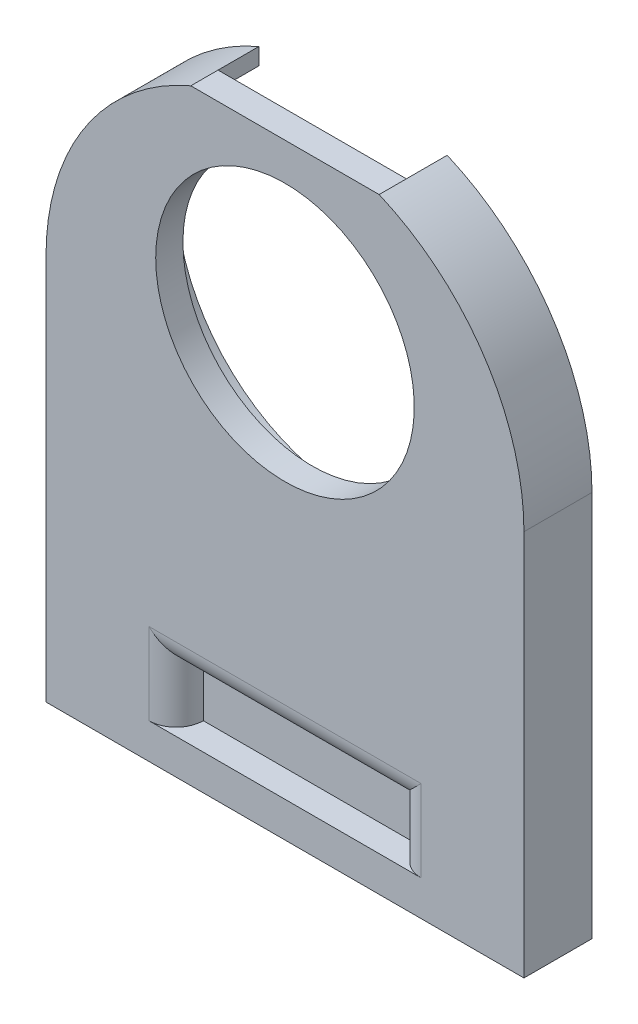
ISO-10303-21;
HEADER;
FILE_DESCRIPTION(('STEP AP214'),'2;1');
FILE_NAME('part.step','',(''),(''),'','','');
FILE_SCHEMA(('AUTOMOTIVE_DESIGN { 1 0 10303 214 1 1 1 1 }'));
ENDSEC;
DATA;
#1=APPLICATION_CONTEXT('core data for automotive mechanical design processes');
#2=APPLICATION_PROTOCOL_DEFINITION('international standard','automotive_design',2000,#1);
#3=PRODUCT_CONTEXT('',#1,'mechanical');
#4=PRODUCT('Part','Part','',(#3));
#5=PRODUCT_RELATED_PRODUCT_CATEGORY('part','',(#4));
#6=PRODUCT_DEFINITION_FORMATION('','',#4);
#7=PRODUCT_DEFINITION_CONTEXT('part definition',#1,'design');
#8=PRODUCT_DEFINITION('design','',#6,#7);
#9=PRODUCT_DEFINITION_SHAPE('','',#8);
#10=(LENGTH_UNIT() NAMED_UNIT(*) SI_UNIT(.MILLI.,.METRE.));
#11=(NAMED_UNIT(*) PLANE_ANGLE_UNIT() SI_UNIT($,.RADIAN.));
#12=(NAMED_UNIT(*) SI_UNIT($,.STERADIAN.) SOLID_ANGLE_UNIT());
#13=UNCERTAINTY_MEASURE_WITH_UNIT(LENGTH_MEASURE(1.E-05),#10,'distance_accuracy_value','');
#14=(GEOMETRIC_REPRESENTATION_CONTEXT(3) GLOBAL_UNCERTAINTY_ASSIGNED_CONTEXT((#13)) GLOBAL_UNIT_ASSIGNED_CONTEXT((#10,
#11,#12)) REPRESENTATION_CONTEXT('',''));
#15=CARTESIAN_POINT('',(0.,0.,0.));
#16=DIRECTION('',(0.,0.,1.));
#17=DIRECTION('',(1.,0.,0.));
#18=AXIS2_PLACEMENT_3D('',#15,#16,#17);
#19=CARTESIAN_POINT('',(8.78,8.5,1.5));
#20=DIRECTION('',(0.,0.,-1.));
#21=DIRECTION('',(-1.,0.,0.));
#22=AXIS2_PLACEMENT_3D('',#19,#20,#21);
#23=CYLINDRICAL_SURFACE('',#22,6.5);
#24=CARTESIAN_POINT('',(8.78,8.5,0.));
#25=DIRECTION('',(0.,0.,1.));
#26=DIRECTION('',(1.,0.,0.));
#27=AXIS2_PLACEMENT_3D('',#24,#25,#26);
#28=CIRCLE('',#27,6.5);
#29=CARTESIAN_POINT('',(5.32,14.0025812124856,0.));
#30=VERTEX_POINT('',#29);
#31=CARTESIAN_POINT('',(12.24,14.0025812124856,0.));
#32=VERTEX_POINT('',#31);
#33=EDGE_CURVE('E193',#30,#32,#28,.T.);
#34=ORIENTED_EDGE('',*,*,#33,.F.);
#35=DIRECTION('',(0.,0.,-1.));
#36=VECTOR('',#35,1.);
#37=CARTESIAN_POINT('',(5.32,14.0025812124856,1.5));
#38=LINE('',#37,#36);
#39=CARTESIAN_POINT('',(5.32,14.0025812124856,1.5));
#40=VERTEX_POINT('',#39);
#41=EDGE_CURVE('E232',#40,#30,#38,.T.);
#42=ORIENTED_EDGE('',*,*,#41,.F.);
#43=CARTESIAN_POINT('',(8.78,8.5,1.5));
#44=DIRECTION('',(0.,0.,1.));
#45=DIRECTION('',(1.,0.,0.));
#46=AXIS2_PLACEMENT_3D('',#43,#44,#45);
#47=CIRCLE('',#46,6.5);
#48=CARTESIAN_POINT('',(12.24,14.0025812124856,1.5));
#49=VERTEX_POINT('',#48);
#50=EDGE_CURVE('E194',#40,#49,#47,.T.);
#51=ORIENTED_EDGE('',*,*,#50,.T.);
#52=DIRECTION('',(0.,0.,-1.));
#53=VECTOR('',#52,1.);
#54=CARTESIAN_POINT('',(12.24,14.0025812124856,1.5));
#55=LINE('',#54,#53);
#56=EDGE_CURVE('E203',#49,#32,#55,.T.);
#57=ORIENTED_EDGE('',*,*,#56,.T.);
#58=EDGE_LOOP('',(#34,#42,#51,#57));
#59=FACE_BOUND('',#58,.T.);
#60=ADVANCED_FACE('F34',(#59),#23,.F.);
#61=CARTESIAN_POINT('',(5.32,0.,1.5));
#62=DIRECTION('',(-1.,0.,0.));
#63=DIRECTION('',(0.,0.,1.));
#64=AXIS2_PLACEMENT_3D('',#61,#62,#63);
#65=PLANE('',#64);
#66=DIRECTION('',(0.,1.,0.));
#67=VECTOR('',#66,1.);
#68=CARTESIAN_POINT('',(5.32,0.,0.));
#69=LINE('',#68,#67);
#70=CARTESIAN_POINT('',(5.32,14.6194981256581,0.));
#71=VERTEX_POINT('',#70);
#72=EDGE_CURVE('E206',#30,#71,#69,.T.);
#73=ORIENTED_EDGE('',*,*,#72,.T.);
#74=DIRECTION('',(0.,0.,-1.));
#75=VECTOR('',#74,1.);
#76=CARTESIAN_POINT('',(5.32,14.6194981256581,1.5));
#77=LINE('',#76,#75);
#78=CARTESIAN_POINT('',(5.32,14.6194981256581,1.5));
#79=VERTEX_POINT('',#78);
#80=EDGE_CURVE('E229',#79,#71,#77,.T.);
#81=ORIENTED_EDGE('',*,*,#80,.F.);
#82=DIRECTION('',(0.,1.,0.));
#83=VECTOR('',#82,1.);
#84=CARTESIAN_POINT('',(5.32,0.,1.5));
#85=LINE('',#84,#83);
#86=EDGE_CURVE('E197',#40,#79,#85,.T.);
#87=ORIENTED_EDGE('',*,*,#86,.F.);
#88=ORIENTED_EDGE('',*,*,#41,.T.);
#89=EDGE_LOOP('',(#73,#81,#87,#88));
#90=FACE_BOUND('',#89,.T.);
#91=ADVANCED_FACE('F255',(#90),#65,.F.);
#92=CARTESIAN_POINT('',(8.78,6.55,1.5));
#93=DIRECTION('',(0.,0.,-1.));
#94=DIRECTION('',(-1.,0.,0.));
#95=AXIS2_PLACEMENT_3D('',#92,#93,#94);
#96=CYLINDRICAL_SURFACE('',#95,8.78);
#97=CARTESIAN_POINT('',(8.78,6.55,0.));
#98=DIRECTION('',(0.,0.,1.));
#99=DIRECTION('',(1.,0.,0.));
#100=AXIS2_PLACEMENT_3D('',#97,#98,#99);
#101=CIRCLE('',#100,8.78);
#102=CARTESIAN_POINT('',(0.,6.55,0.));
#103=VERTEX_POINT('',#102);
#104=EDGE_CURVE('E208',#71,#103,#101,.T.);
#105=ORIENTED_EDGE('',*,*,#104,.T.);
#106=DIRECTION('',(0.,0.,-1.));
#107=VECTOR('',#106,1.);
#108=CARTESIAN_POINT('',(0.,6.55,1.5));
#109=LINE('',#108,#107);
#110=CARTESIAN_POINT('',(0.,6.55,2.5));
#111=VERTEX_POINT('',#110);
#112=EDGE_CURVE('E227',#111,#103,#109,.T.);
#113=ORIENTED_EDGE('',*,*,#112,.F.);
#114=CARTESIAN_POINT('',(8.78,6.55,2.5));
#115=DIRECTION('',(0.,0.,1.));
#116=DIRECTION('',(1.,0.,0.));
#117=AXIS2_PLACEMENT_3D('',#114,#115,#116);
#118=CIRCLE('',#117,8.78);
#119=CARTESIAN_POINT('',(5.32,14.6194981256581,2.5));
#120=VERTEX_POINT('',#119);
#121=EDGE_CURVE('E178',#120,#111,#118,.T.);
#122=ORIENTED_EDGE('',*,*,#121,.F.);
#123=DIRECTION('',(0.,0.,-1.));
#124=VECTOR('',#123,1.);
#125=CARTESIAN_POINT('',(5.32,14.6194981256581,2.5));
#126=LINE('',#125,#124);
#127=EDGE_CURVE('E186',#120,#79,#126,.T.);
#128=ORIENTED_EDGE('',*,*,#127,.T.);
#129=ORIENTED_EDGE('',*,*,#80,.T.);
#130=EDGE_LOOP('',(#105,#113,#122,#128,#129));
#131=FACE_BOUND('',#130,.T.);
#132=ADVANCED_FACE('F261',(#131),#96,.T.);
#133=CARTESIAN_POINT('',(0.,0.,1.5));
#134=DIRECTION('',(-1.,0.,0.));
#135=DIRECTION('',(0.,0.,1.));
#136=AXIS2_PLACEMENT_3D('',#133,#134,#135);
#137=PLANE('',#136);
#138=DIRECTION('',(0.,1.,0.));
#139=VECTOR('',#138,1.);
#140=CARTESIAN_POINT('',(0.,0.,0.));
#141=LINE('',#140,#139);
#142=CARTESIAN_POINT('',(0.,-7.65,0.));
#143=VERTEX_POINT('',#142);
#144=EDGE_CURVE('E211',#143,#103,#141,.T.);
#145=ORIENTED_EDGE('',*,*,#144,.F.);
#146=DIRECTION('',(0.,0.,-1.));
#147=VECTOR('',#146,1.);
#148=CARTESIAN_POINT('',(0.,-7.65,2.5));
#149=LINE('',#148,#147);
#150=CARTESIAN_POINT('',(0.,-7.65,2.5));
#151=VERTEX_POINT('',#150);
#152=EDGE_CURVE('E157',#151,#143,#149,.T.);
#153=ORIENTED_EDGE('',*,*,#152,.F.);
#154=DIRECTION('',(0.,-1.,0.));
#155=VECTOR('',#154,1.);
#156=CARTESIAN_POINT('',(0.,0.,2.5));
#157=LINE('',#156,#155);
#158=EDGE_CURVE('E181',#111,#151,#157,.T.);
#159=ORIENTED_EDGE('',*,*,#158,.F.);
#160=ORIENTED_EDGE('',*,*,#112,.T.);
#161=EDGE_LOOP('',(#145,#153,#159,#160));
#162=FACE_BOUND('',#161,.T.);
#163=ADVANCED_FACE('F327',(#162),#137,.T.);
#164=CARTESIAN_POINT('',(17.56,0.,1.5));
#165=DIRECTION('',(-1.,0.,0.));
#166=DIRECTION('',(0.,0.,1.));
#167=AXIS2_PLACEMENT_3D('',#164,#165,#166);
#168=PLANE('',#167);
#169=DIRECTION('',(0.,1.,0.));
#170=VECTOR('',#169,1.);
#171=CARTESIAN_POINT('',(17.56,0.,0.));
#172=LINE('',#171,#170);
#173=CARTESIAN_POINT('',(17.56,-7.65,0.));
#174=VERTEX_POINT('',#173);
#175=CARTESIAN_POINT('',(17.56,6.55,0.));
#176=VERTEX_POINT('',#175);
#177=EDGE_CURVE('E214',#174,#176,#172,.T.);
#178=ORIENTED_EDGE('',*,*,#177,.T.);
#179=DIRECTION('',(0.,0.,-1.));
#180=VECTOR('',#179,1.);
#181=CARTESIAN_POINT('',(17.56,6.55,1.5));
#182=LINE('',#181,#180);
#183=CARTESIAN_POINT('',(17.56,6.55,2.5));
#184=VERTEX_POINT('',#183);
#185=EDGE_CURVE('E224',#184,#176,#182,.T.);
#186=ORIENTED_EDGE('',*,*,#185,.F.);
#187=DIRECTION('',(0.,1.,0.));
#188=VECTOR('',#187,1.);
#189=CARTESIAN_POINT('',(17.56,0.,2.5));
#190=LINE('',#189,#188);
#191=CARTESIAN_POINT('',(17.56,-7.65,2.5));
#192=VERTEX_POINT('',#191);
#193=EDGE_CURVE('E183',#192,#184,#190,.T.);
#194=ORIENTED_EDGE('',*,*,#193,.F.);
#195=DIRECTION('',(0.,0.,1.));
#196=VECTOR('',#195,1.);
#197=CARTESIAN_POINT('',(17.56,-7.65,0.));
#198=LINE('',#197,#196);
#199=EDGE_CURVE('E163',#174,#192,#198,.T.);
#200=ORIENTED_EDGE('',*,*,#199,.F.);
#201=EDGE_LOOP('',(#178,#186,#194,#200));
#202=FACE_BOUND('',#201,.T.);
#203=ADVANCED_FACE('F322',(#202),#168,.F.);
#204=CARTESIAN_POINT('',(8.78,6.55,1.5));
#205=DIRECTION('',(0.,0.,-1.));
#206=DIRECTION('',(-1.,0.,0.));
#207=AXIS2_PLACEMENT_3D('',#204,#205,#206);
#208=CYLINDRICAL_SURFACE('',#207,8.78);
#209=CARTESIAN_POINT('',(8.78,6.55,0.));
#210=DIRECTION('',(0.,0.,1.));
#211=DIRECTION('',(1.,0.,0.));
#212=AXIS2_PLACEMENT_3D('',#209,#210,#211);
#213=CIRCLE('',#212,8.78);
#214=CARTESIAN_POINT('',(12.24,14.6194981256581,0.));
#215=VERTEX_POINT('',#214);
#216=EDGE_CURVE('E216',#176,#215,#213,.T.);
#217=ORIENTED_EDGE('',*,*,#216,.T.);
#218=DIRECTION('',(0.,0.,-1.));
#219=VECTOR('',#218,1.);
#220=CARTESIAN_POINT('',(12.24,14.6194981256581,1.5));
#221=LINE('',#220,#219);
#222=CARTESIAN_POINT('',(12.24,14.6194981256581,1.5));
#223=VERTEX_POINT('',#222);
#224=EDGE_CURVE('E222',#223,#215,#221,.T.);
#225=ORIENTED_EDGE('',*,*,#224,.F.);
#226=DIRECTION('',(0.,0.,-1.));
#227=VECTOR('',#226,1.);
#228=CARTESIAN_POINT('',(12.24,14.6194981256581,2.5));
#229=LINE('',#228,#227);
#230=CARTESIAN_POINT('',(12.24,14.6194981256581,2.5));
#231=VERTEX_POINT('',#230);
#232=EDGE_CURVE('E190',#231,#223,#229,.T.);
#233=ORIENTED_EDGE('',*,*,#232,.F.);
#234=CARTESIAN_POINT('',(8.78,6.55,2.5));
#235=DIRECTION('',(0.,0.,1.));
#236=DIRECTION('',(1.,0.,0.));
#237=AXIS2_PLACEMENT_3D('',#234,#235,#236);
#238=CIRCLE('',#237,8.78);
#239=EDGE_CURVE('E173',#184,#231,#238,.T.);
#240=ORIENTED_EDGE('',*,*,#239,.F.);
#241=ORIENTED_EDGE('',*,*,#185,.T.);
#242=EDGE_LOOP('',(#217,#225,#233,#240,#241));
#243=FACE_BOUND('',#242,.T.);
#244=ADVANCED_FACE('F326',(#243),#208,.T.);
#245=CARTESIAN_POINT('',(12.24,0.,1.5));
#246=DIRECTION('',(-1.,0.,0.));
#247=DIRECTION('',(0.,0.,1.));
#248=AXIS2_PLACEMENT_3D('',#245,#246,#247);
#249=PLANE('',#248);
#250=DIRECTION('',(0.,1.,0.));
#251=VECTOR('',#250,1.);
#252=CARTESIAN_POINT('',(12.24,0.,0.));
#253=LINE('',#252,#251);
#254=EDGE_CURVE('E198',#32,#215,#253,.T.);
#255=ORIENTED_EDGE('',*,*,#254,.F.);
#256=ORIENTED_EDGE('',*,*,#56,.F.);
#257=DIRECTION('',(0.,1.,0.));
#258=VECTOR('',#257,1.);
#259=CARTESIAN_POINT('',(12.24,0.,1.5));
#260=LINE('',#259,#258);
#261=EDGE_CURVE('E200',#49,#223,#260,.T.);
#262=ORIENTED_EDGE('',*,*,#261,.T.);
#263=ORIENTED_EDGE('',*,*,#224,.T.);
#264=EDGE_LOOP('',(#255,#256,#262,#263));
#265=FACE_BOUND('',#264,.T.);
#266=ADVANCED_FACE('F312',(#265),#249,.T.);
#267=CARTESIAN_POINT('',(0.,0.,0.));
#268=DIRECTION('',(0.,0.,1.));
#269=DIRECTION('',(1.,0.,0.));
#270=AXIS2_PLACEMENT_3D('',#267,#268,#269);
#271=PLANE('',#270);
#272=ORIENTED_EDGE('',*,*,#33,.T.);
#273=ORIENTED_EDGE('',*,*,#254,.T.);
#274=ORIENTED_EDGE('',*,*,#216,.F.);
#275=ORIENTED_EDGE('',*,*,#177,.F.);
#276=DIRECTION('',(1.,0.,0.));
#277=VECTOR('',#276,1.);
#278=CARTESIAN_POINT('',(0.,-7.65,0.));
#279=LINE('',#278,#277);
#280=EDGE_CURVE('E160',#143,#174,#279,.T.);
#281=ORIENTED_EDGE('',*,*,#280,.F.);
#282=ORIENTED_EDGE('',*,*,#144,.T.);
#283=ORIENTED_EDGE('',*,*,#104,.F.);
#284=ORIENTED_EDGE('',*,*,#72,.F.);
#285=EDGE_LOOP('',(#272,#273,#274,#275,#281,#282,#283,#284));
#286=FACE_BOUND('',#285,.T.);
#287=ADVANCED_FACE('F307',(#286),#271,.F.);
#288=CARTESIAN_POINT('',(0.,0.,1.5));
#289=DIRECTION('',(0.,0.,1.));
#290=DIRECTION('',(1.,0.,0.));
#291=AXIS2_PLACEMENT_3D('',#288,#289,#290);
#292=PLANE('',#291);
#293=CARTESIAN_POINT('',(8.78,8.5,1.5));
#294=DIRECTION('',(0.,0.,-1.));
#295=DIRECTION('',(-1.,0.,0.));
#296=AXIS2_PLACEMENT_3D('',#293,#294,#295);
#297=CIRCLE('',#296,4.75);
#298=CARTESIAN_POINT('',(4.03,8.5,1.5));
#299=VERTEX_POINT('',#298);
#300=EDGE_CURVE('E166',#299,#299,#297,.T.);
#301=ORIENTED_EDGE('',*,*,#300,.F.);
#302=EDGE_LOOP('',(#301));
#303=FACE_BOUND('',#302,.T.);
#304=ORIENTED_EDGE('',*,*,#50,.F.);
#305=ORIENTED_EDGE('',*,*,#86,.T.);
#306=DIRECTION('',(1.,0.,0.));
#307=VECTOR('',#306,1.);
#308=CARTESIAN_POINT('',(0.,14.6194981256581,1.5));
#309=LINE('',#308,#307);
#310=EDGE_CURVE('E170',#79,#223,#309,.T.);
#311=ORIENTED_EDGE('',*,*,#310,.T.);
#312=ORIENTED_EDGE('',*,*,#261,.F.);
#313=EDGE_LOOP('',(#304,#305,#311,#312));
#314=FACE_BOUND('',#313,.T.);
#315=ADVANCED_FACE('F311',(#303,#314),#292,.F.);
#316=CARTESIAN_POINT('',(0.,14.6194981256581,2.5));
#317=DIRECTION('',(0.,1.,0.));
#318=DIRECTION('',(0.,0.,1.));
#319=AXIS2_PLACEMENT_3D('',#316,#317,#318);
#320=PLANE('',#319);
#321=ORIENTED_EDGE('',*,*,#310,.F.);
#322=ORIENTED_EDGE('',*,*,#127,.F.);
#323=DIRECTION('',(1.,0.,0.));
#324=VECTOR('',#323,1.);
#325=CARTESIAN_POINT('',(0.,14.6194981256581,2.5));
#326=LINE('',#325,#324);
#327=EDGE_CURVE('E175',#120,#231,#326,.T.);
#328=ORIENTED_EDGE('',*,*,#327,.T.);
#329=ORIENTED_EDGE('',*,*,#232,.T.);
#330=EDGE_LOOP('',(#321,#322,#328,#329));
#331=FACE_BOUND('',#330,.T.);
#332=ADVANCED_FACE('F293',(#331),#320,.T.);
#333=CARTESIAN_POINT('',(0.,0.,2.5));
#334=DIRECTION('',(0.,0.,1.));
#335=DIRECTION('',(1.,0.,0.));
#336=AXIS2_PLACEMENT_3D('',#333,#334,#335);
#337=PLANE('',#336);
#338=DIRECTION('',(0.,1.,0.));
#339=VECTOR('',#338,1.);
#340=CARTESIAN_POINT('',(13.78,-6.35316683145248,2.5));
#341=LINE('',#340,#339);
#342=CARTESIAN_POINT('',(13.78,-3.35316683145248,2.5));
#343=VERTEX_POINT('',#342);
#344=CARTESIAN_POINT('',(13.78,-6.35316683145248,2.5));
#345=VERTEX_POINT('',#344);
#346=EDGE_CURVE('E141',#343,#345,#341,.F.);
#347=ORIENTED_EDGE('',*,*,#346,.T.);
#348=DIRECTION('',(1.,0.,0.));
#349=VECTOR('',#348,1.);
#350=CARTESIAN_POINT('',(12.78,-6.35316683145248,2.5));
#351=LINE('',#350,#349);
#352=CARTESIAN_POINT('',(3.78,-6.35316683145248,2.5));
#353=VERTEX_POINT('',#352);
#354=EDGE_CURVE('E51',#353,#345,#351,.T.);
#355=ORIENTED_EDGE('',*,*,#354,.F.);
#356=DIRECTION('',(0.,-1.,0.));
#357=VECTOR('',#356,1.);
#358=CARTESIAN_POINT('',(3.78,-4.35316683145248,2.5));
#359=LINE('',#358,#357);
#360=CARTESIAN_POINT('',(3.78,-3.35316683145248,2.5));
#361=VERTEX_POINT('',#360);
#362=EDGE_CURVE('E237',#353,#361,#359,.F.);
#363=ORIENTED_EDGE('',*,*,#362,.T.);
#364=DIRECTION('',(-1.,0.,0.));
#365=VECTOR('',#364,1.);
#366=CARTESIAN_POINT('',(12.78,-3.35316683145248,2.5));
#367=LINE('',#366,#365);
#368=EDGE_CURVE('E234',#361,#343,#367,.F.);
#369=ORIENTED_EDGE('',*,*,#368,.T.);
#370=EDGE_LOOP('',(#347,#355,#363,#369));
#371=FACE_BOUND('',#370,.T.);
#372=CARTESIAN_POINT('',(8.78,8.5,2.5));
#373=DIRECTION('',(0.,0.,-1.));
#374=DIRECTION('',(-1.,0.,0.));
#375=AXIS2_PLACEMENT_3D('',#372,#373,#374);
#376=CIRCLE('',#375,4.75);
#377=CARTESIAN_POINT('',(4.03,8.5,2.5));
#378=VERTEX_POINT('',#377);
#379=EDGE_CURVE('E167',#378,#378,#376,.T.);
#380=ORIENTED_EDGE('',*,*,#379,.T.);
#381=EDGE_LOOP('',(#380));
#382=FACE_BOUND('',#381,.T.);
#383=ORIENTED_EDGE('',*,*,#239,.T.);
#384=ORIENTED_EDGE('',*,*,#327,.F.);
#385=ORIENTED_EDGE('',*,*,#121,.T.);
#386=ORIENTED_EDGE('',*,*,#158,.T.);
#387=DIRECTION('',(-1.,0.,0.));
#388=VECTOR('',#387,1.);
#389=CARTESIAN_POINT('',(17.56,-7.65,2.5));
#390=LINE('',#389,#388);
#391=EDGE_CURVE('E153',#192,#151,#390,.T.);
#392=ORIENTED_EDGE('',*,*,#391,.F.);
#393=ORIENTED_EDGE('',*,*,#193,.T.);
#394=EDGE_LOOP('',(#383,#384,#385,#386,#392,#393));
#395=FACE_BOUND('',#394,.T.);
#396=ADVANCED_FACE('F288',(#371,#382,#395),#337,.T.);
#397=CARTESIAN_POINT('',(8.78,8.5,2.5));
#398=DIRECTION('',(0.,0.,-1.));
#399=DIRECTION('',(-1.,0.,0.));
#400=AXIS2_PLACEMENT_3D('',#397,#398,#399);
#401=CYLINDRICAL_SURFACE('',#400,4.75);
#402=ORIENTED_EDGE('',*,*,#379,.F.);
#403=EDGE_LOOP('',(#402));
#404=FACE_BOUND('',#403,.T.);
#405=ORIENTED_EDGE('',*,*,#300,.T.);
#406=EDGE_LOOP('',(#405));
#407=FACE_BOUND('',#406,.T.);
#408=ADVANCED_FACE('F251',(#404,#407),#401,.F.);
#409=CARTESIAN_POINT('',(0.,-7.65,0.));
#410=DIRECTION('',(0.,-1.,0.));
#411=DIRECTION('',(0.,0.,-1.));
#412=AXIS2_PLACEMENT_3D('',#409,#410,#411);
#413=PLANE('',#412);
#414=ORIENTED_EDGE('',*,*,#391,.T.);
#415=ORIENTED_EDGE('',*,*,#152,.T.);
#416=ORIENTED_EDGE('',*,*,#280,.T.);
#417=ORIENTED_EDGE('',*,*,#199,.T.);
#418=EDGE_LOOP('',(#414,#415,#416,#417));
#419=FACE_BOUND('',#418,.T.);
#420=ADVANCED_FACE('F244',(#419),#413,.T.);
#421=CARTESIAN_POINT('',(12.78,-6.35316683145248,1.5));
#422=DIRECTION('',(0.,-1.,0.));
#423=DIRECTION('',(1.,0.,0.));
#424=AXIS2_PLACEMENT_3D('',#421,#422,#423);
#425=PLANE('',#424);
#426=ORIENTED_EDGE('',*,*,#354,.T.);
#427=CARTESIAN_POINT('',(13.78,-6.35316683145248,1.5));
#428=DIRECTION('',(0.,-1.,0.));
#429=DIRECTION('',(1.,0.,0.));
#430=AXIS2_PLACEMENT_3D('',#427,#428,#429);
#431=CIRCLE('',#430,1.);
#432=CARTESIAN_POINT('',(12.78,-6.35316683145248,1.5));
#433=VERTEX_POINT('',#432);
#434=EDGE_CURVE('E11',#345,#433,#431,.T.);
#435=ORIENTED_EDGE('',*,*,#434,.T.);
#436=DIRECTION('',(1.,0.,0.));
#437=VECTOR('',#436,1.);
#438=CARTESIAN_POINT('',(12.78,-6.35316683145248,1.5));
#439=LINE('',#438,#437);
#440=CARTESIAN_POINT('',(4.78,-6.35316683145248,1.5));
#441=VERTEX_POINT('',#440);
#442=EDGE_CURVE('E135',#441,#433,#439,.T.);
#443=ORIENTED_EDGE('',*,*,#442,.F.);
#444=CARTESIAN_POINT('',(3.78,-6.35316683145248,1.5));
#445=DIRECTION('',(0.,-1.,0.));
#446=DIRECTION('',(1.,0.,0.));
#447=AXIS2_PLACEMENT_3D('',#444,#445,#446);
#448=CIRCLE('',#447,1.);
#449=EDGE_CURVE('E43',#441,#353,#448,.T.);
#450=ORIENTED_EDGE('',*,*,#449,.T.);
#451=EDGE_LOOP('',(#426,#435,#443,#450));
#452=FACE_BOUND('',#451,.T.);
#453=ADVANCED_FACE('F242',(#452),#425,.F.);
#454=CARTESIAN_POINT('',(0.,0.,1.5));
#455=DIRECTION('',(0.,0.,1.));
#456=DIRECTION('',(1.,0.,0.));
#457=AXIS2_PLACEMENT_3D('',#454,#455,#456);
#458=PLANE('',#457);
#459=DIRECTION('',(0.,1.,0.));
#460=VECTOR('',#459,1.);
#461=CARTESIAN_POINT('',(12.78,-6.35316683145248,1.5));
#462=LINE('',#461,#460);
#463=CARTESIAN_POINT('',(12.78,-4.35316683145248,1.5));
#464=VERTEX_POINT('',#463);
#465=EDGE_CURVE('E127',#433,#464,#462,.T.);
#466=ORIENTED_EDGE('',*,*,#465,.T.);
#467=DIRECTION('',(-1.,0.,0.));
#468=VECTOR('',#467,1.);
#469=CARTESIAN_POINT('',(12.78,-4.35316683145248,1.5));
#470=LINE('',#469,#468);
#471=CARTESIAN_POINT('',(4.78,-4.35316683145248,1.5));
#472=VERTEX_POINT('',#471);
#473=EDGE_CURVE('E132',#464,#472,#470,.T.);
#474=ORIENTED_EDGE('',*,*,#473,.T.);
#475=DIRECTION('',(0.,-1.,0.));
#476=VECTOR('',#475,1.);
#477=CARTESIAN_POINT('',(4.78,-6.35316683145248,1.5));
#478=LINE('',#477,#476);
#479=EDGE_CURVE('E148',#472,#441,#478,.T.);
#480=ORIENTED_EDGE('',*,*,#479,.T.);
#481=ORIENTED_EDGE('',*,*,#442,.T.);
#482=EDGE_LOOP('',(#466,#474,#480,#481));
#483=FACE_BOUND('',#482,.T.);
#484=ADVANCED_FACE('F129',(#483),#458,.T.);
#485=CARTESIAN_POINT('',(13.78,-6.35316683145248,1.5));
#486=DIRECTION('',(0.,-1.,0.));
#487=DIRECTION('',(0.,0.,-1.));
#488=AXIS2_PLACEMENT_3D('',#485,#486,#487);
#489=CYLINDRICAL_SURFACE('',#488,1.);
#490=ORIENTED_EDGE('',*,*,#434,.F.);
#491=ORIENTED_EDGE('',*,*,#346,.F.);
#492=CARTESIAN_POINT('',(13.78,-3.35316683145248,1.5));
#493=DIRECTION('',(0.707106781186547,-0.707106781186547,0.));
#494=DIRECTION('',(-0.707106781186547,-0.707106781186547,0.));
#495=AXIS2_PLACEMENT_3D('',#492,#493,#494);
#496=ELLIPSE('',#495,1.41421356237309,1.);
#497=EDGE_CURVE('E38',#464,#343,#496,.F.);
#498=ORIENTED_EDGE('',*,*,#497,.F.);
#499=ORIENTED_EDGE('',*,*,#465,.F.);
#500=EDGE_LOOP('',(#490,#491,#498,#499));
#501=FACE_BOUND('',#500,.T.);
#502=ADVANCED_FACE('F36',(#501),#489,.T.);
#503=CARTESIAN_POINT('',(12.78,-3.35316683145248,1.5));
#504=DIRECTION('',(1.,0.,0.));
#505=DIRECTION('',(0.,0.,-1.));
#506=AXIS2_PLACEMENT_3D('',#503,#504,#505);
#507=CYLINDRICAL_SURFACE('',#506,1.);
#508=ORIENTED_EDGE('',*,*,#497,.T.);
#509=ORIENTED_EDGE('',*,*,#368,.F.);
#510=CARTESIAN_POINT('',(3.78,-3.35316683145248,1.5));
#511=DIRECTION('',(0.707106781186547,0.707106781186547,0.));
#512=DIRECTION('',(-0.707106781186547,0.707106781186547,0.));
#513=AXIS2_PLACEMENT_3D('',#510,#511,#512);
#514=ELLIPSE('',#513,1.41421356237309,1.);
#515=EDGE_CURVE('E144',#472,#361,#514,.F.);
#516=ORIENTED_EDGE('',*,*,#515,.F.);
#517=ORIENTED_EDGE('',*,*,#473,.F.);
#518=EDGE_LOOP('',(#508,#509,#516,#517));
#519=FACE_BOUND('',#518,.T.);
#520=ADVANCED_FACE('F145',(#519),#507,.T.);
#521=CARTESIAN_POINT('',(3.78,-6.35316683145248,1.5));
#522=DIRECTION('',(0.,1.,0.));
#523=DIRECTION('',(0.,0.,1.));
#524=AXIS2_PLACEMENT_3D('',#521,#522,#523);
#525=CYLINDRICAL_SURFACE('',#524,1.);
#526=ORIENTED_EDGE('',*,*,#515,.T.);
#527=ORIENTED_EDGE('',*,*,#362,.F.);
#528=ORIENTED_EDGE('',*,*,#449,.F.);
#529=ORIENTED_EDGE('',*,*,#479,.F.);
#530=EDGE_LOOP('',(#526,#527,#528,#529));
#531=FACE_BOUND('',#530,.T.);
#532=ADVANCED_FACE('F241',(#531),#525,.T.);
#533=CLOSED_SHELL('',(#60,#91,#132,#163,#203,#244,#266,#287,#315,#332,#396,#408,#420,#453,#484,
#502,#520,#532));
#534=MANIFOLD_SOLID_BREP('B2',#533);
#535=ADVANCED_BREP_SHAPE_REPRESENTATION('',(#18,#534),#14);
#536=SHAPE_DEFINITION_REPRESENTATION(#9,#535);
ENDSEC;
END-ISO-10303-21;
